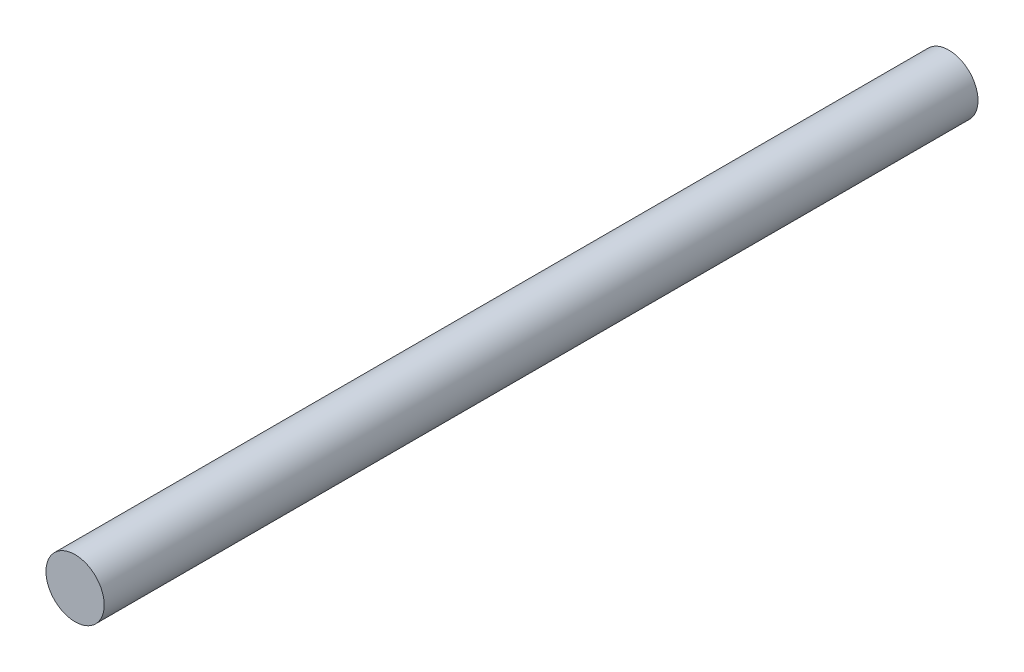
ISO-10303-21;
HEADER;
FILE_DESCRIPTION(('STEP AP214'),'2;1');
FILE_NAME('part.step','',(''),(''),'','','');
FILE_SCHEMA(('AUTOMOTIVE_DESIGN { 1 0 10303 214 1 1 1 1 }'));
ENDSEC;
DATA;
#1=APPLICATION_CONTEXT('core data for automotive mechanical design processes');
#2=APPLICATION_PROTOCOL_DEFINITION('international standard','automotive_design',2000,#1);
#3=PRODUCT_CONTEXT('',#1,'mechanical');
#4=PRODUCT('Part','Part','',(#3));
#5=PRODUCT_RELATED_PRODUCT_CATEGORY('part','',(#4));
#6=PRODUCT_DEFINITION_FORMATION('','',#4);
#7=PRODUCT_DEFINITION_CONTEXT('part definition',#1,'design');
#8=PRODUCT_DEFINITION('design','',#6,#7);
#9=PRODUCT_DEFINITION_SHAPE('','',#8);
#10=(LENGTH_UNIT() NAMED_UNIT(*) SI_UNIT(.MILLI.,.METRE.));
#11=(NAMED_UNIT(*) PLANE_ANGLE_UNIT() SI_UNIT($,.RADIAN.));
#12=(NAMED_UNIT(*) SI_UNIT($,.STERADIAN.) SOLID_ANGLE_UNIT());
#13=UNCERTAINTY_MEASURE_WITH_UNIT(LENGTH_MEASURE(1.E-05),#10,'distance_accuracy_value','');
#14=(GEOMETRIC_REPRESENTATION_CONTEXT(3) GLOBAL_UNCERTAINTY_ASSIGNED_CONTEXT((#13)) GLOBAL_UNIT_ASSIGNED_CONTEXT((#10,
#11,#12)) REPRESENTATION_CONTEXT('',''));
#15=CARTESIAN_POINT('',(0.,0.,0.));
#16=DIRECTION('',(0.,0.,1.));
#17=DIRECTION('',(1.,0.,0.));
#18=AXIS2_PLACEMENT_3D('',#15,#16,#17);
#19=CARTESIAN_POINT('',(0.,0.,1500.));
#20=DIRECTION('',(0.,0.,-1.));
#21=DIRECTION('',(-1.,0.,0.));
#22=AXIS2_PLACEMENT_3D('',#19,#20,#21);
#23=CYLINDRICAL_SURFACE('',#22,50.);
#24=CARTESIAN_POINT('',(0.,0.,1500.));
#25=DIRECTION('',(0.,0.,1.));
#26=DIRECTION('',(1.,0.,0.));
#27=AXIS2_PLACEMENT_3D('',#24,#25,#26);
#28=CIRCLE('',#27,50.);
#29=CARTESIAN_POINT('',(50.,0.,1500.));
#30=VERTEX_POINT('',#29);
#31=EDGE_CURVE('E10',#30,#30,#28,.T.);
#32=ORIENTED_EDGE('',*,*,#31,.F.);
#33=EDGE_LOOP('',(#32));
#34=FACE_BOUND('',#33,.T.);
#35=CARTESIAN_POINT('',(0.,0.,0.));
#36=DIRECTION('',(0.,0.,1.));
#37=DIRECTION('',(1.,0.,0.));
#38=AXIS2_PLACEMENT_3D('',#35,#36,#37);
#39=CIRCLE('',#38,50.);
#40=CARTESIAN_POINT('',(50.,0.,0.));
#41=VERTEX_POINT('',#40);
#42=EDGE_CURVE('E34',#41,#41,#39,.T.);
#43=ORIENTED_EDGE('',*,*,#42,.T.);
#44=EDGE_LOOP('',(#43));
#45=FACE_BOUND('',#44,.T.);
#46=ADVANCED_FACE('F31',(#34,#45),#23,.T.);
#47=CARTESIAN_POINT('',(0.,0.,1500.));
#48=DIRECTION('',(0.,0.,1.));
#49=DIRECTION('',(1.,0.,0.));
#50=AXIS2_PLACEMENT_3D('',#47,#48,#49);
#51=PLANE('',#50);
#52=ORIENTED_EDGE('',*,*,#31,.T.);
#53=EDGE_LOOP('',(#52));
#54=FACE_BOUND('',#53,.T.);
#55=ADVANCED_FACE('F46',(#54),#51,.T.);
#56=CARTESIAN_POINT('',(0.,0.,0.));
#57=DIRECTION('',(0.,0.,1.));
#58=DIRECTION('',(1.,0.,0.));
#59=AXIS2_PLACEMENT_3D('',#56,#57,#58);
#60=PLANE('',#59);
#61=ORIENTED_EDGE('',*,*,#42,.F.);
#62=EDGE_LOOP('',(#61));
#63=FACE_BOUND('',#62,.T.);
#64=ADVANCED_FACE('F44',(#63),#60,.F.);
#65=CLOSED_SHELL('',(#46,#55,#64));
#66=MANIFOLD_SOLID_BREP('B2',#65);
#67=ADVANCED_BREP_SHAPE_REPRESENTATION('',(#18,#66),#14);
#68=SHAPE_DEFINITION_REPRESENTATION(#9,#67);
ENDSEC;
END-ISO-10303-21;
